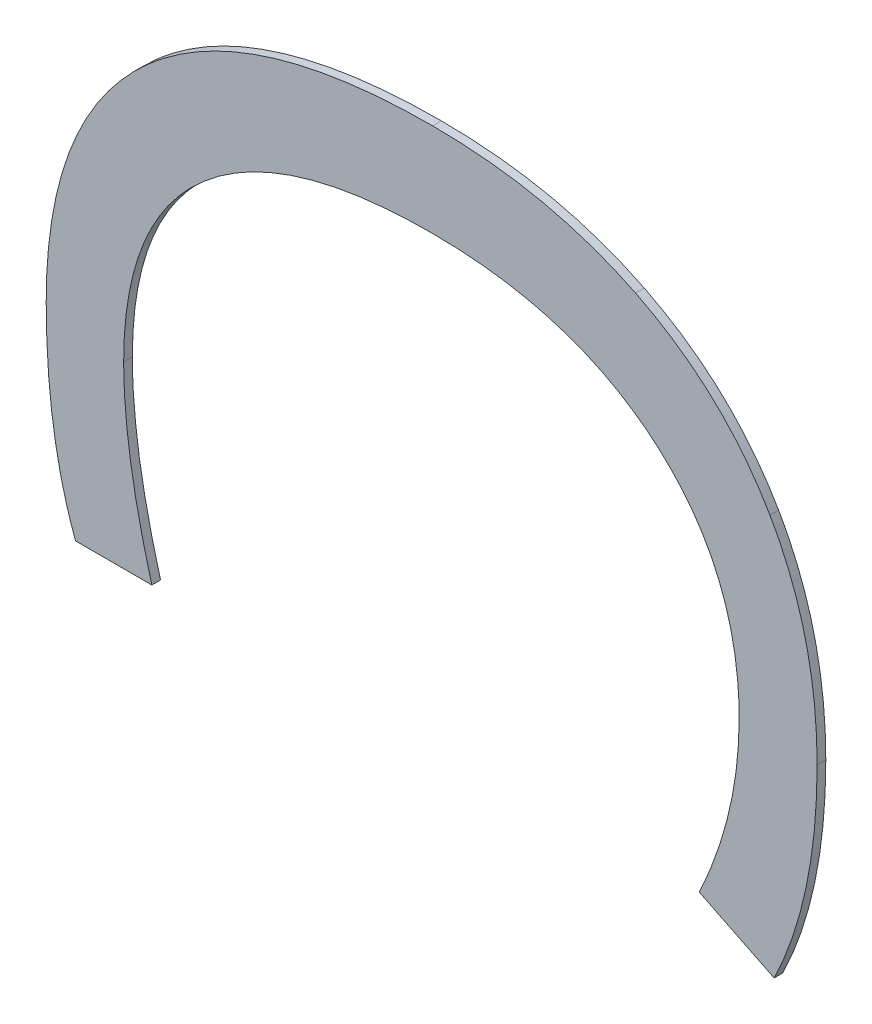
ISO-10303-21;
HEADER;
FILE_DESCRIPTION(('STEP AP214'),'2;1');
FILE_NAME('part.step','',(''),(''),'','','');
FILE_SCHEMA(('AUTOMOTIVE_DESIGN { 1 0 10303 214 1 1 1 1 }'));
ENDSEC;
DATA;
#1=APPLICATION_CONTEXT('core data for automotive mechanical design processes');
#2=APPLICATION_PROTOCOL_DEFINITION('international standard','automotive_design',2000,#1);
#3=PRODUCT_CONTEXT('',#1,'mechanical');
#4=PRODUCT('Part','Part','',(#3));
#5=PRODUCT_RELATED_PRODUCT_CATEGORY('part','',(#4));
#6=PRODUCT_DEFINITION_FORMATION('','',#4);
#7=PRODUCT_DEFINITION_CONTEXT('part definition',#1,'design');
#8=PRODUCT_DEFINITION('design','',#6,#7);
#9=PRODUCT_DEFINITION_SHAPE('','',#8);
#10=(LENGTH_UNIT() NAMED_UNIT(*) SI_UNIT(.MILLI.,.METRE.));
#11=(NAMED_UNIT(*) PLANE_ANGLE_UNIT() SI_UNIT($,.RADIAN.));
#12=(NAMED_UNIT(*) SI_UNIT($,.STERADIAN.) SOLID_ANGLE_UNIT());
#13=UNCERTAINTY_MEASURE_WITH_UNIT(LENGTH_MEASURE(1.E-05),#10,'distance_accuracy_value','');
#14=(GEOMETRIC_REPRESENTATION_CONTEXT(3) GLOBAL_UNCERTAINTY_ASSIGNED_CONTEXT((#13)) GLOBAL_UNIT_ASSIGNED_CONTEXT((#10,
#11,#12)) REPRESENTATION_CONTEXT('',''));
#15=CARTESIAN_POINT('',(0.,0.,0.));
#16=DIRECTION('',(0.,0.,1.));
#17=DIRECTION('',(1.,0.,0.));
#18=AXIS2_PLACEMENT_3D('',#15,#16,#17);
#19=CARTESIAN_POINT('',(32.574920494297,13.734089114766,2.64));
#20=DIRECTION('',(0.,0.,1.));
#21=DIRECTION('',(1.,0.,0.));
#22=AXIS2_PLACEMENT_3D('',#19,#20,#21);
#23=PLANE('',#22);
#24=CARTESIAN_POINT('',(34.040654150706,16.497481452448,2.64));
#25=CARTESIAN_POINT('',(34.205623605908,16.497481452448,2.64));
#26=CARTESIAN_POINT('',(34.300499961164,16.414996724847,2.64));
#27=B_SPLINE_CURVE_WITH_KNOTS('',2,(#24,#25,#26),.UNSPECIFIED.,.F.,.F.,(3,3),(0.,1.),.UNSPECIFIED.);
#28=CARTESIAN_POINT('',(34.300499961164,16.414996724847,2.64));
#29=VERTEX_POINT('',#28);
#30=CARTESIAN_POINT('',(34.040654150706,16.497481452448,2.64));
#31=VERTEX_POINT('',#30);
#32=EDGE_CURVE('E272',#29,#31,#27,.F.);
#33=ORIENTED_EDGE('',*,*,#32,.T.);
#34=CARTESIAN_POINT('',(33.778538118387,16.41792909475,2.64));
#35=CARTESIAN_POINT('',(33.871144251783,16.497481452448,2.64));
#36=CARTESIAN_POINT('',(34.040654150706,16.497481452448,2.64));
#37=B_SPLINE_CURVE_WITH_KNOTS('',2,(#34,#35,#36),.UNSPECIFIED.,.F.,.F.,(3,3),(0.,1.),.UNSPECIFIED.);
#38=CARTESIAN_POINT('',(33.778538118387,16.41792909475,2.64));
#39=VERTEX_POINT('',#38);
#40=EDGE_CURVE('E263',#31,#39,#37,.F.);
#41=ORIENTED_EDGE('',*,*,#40,.T.);
#42=CARTESIAN_POINT('',(33.685931984991,16.191190686425,2.64));
#43=CARTESIAN_POINT('',(33.685931984991,16.338376737053,2.64));
#44=CARTESIAN_POINT('',(33.778538118387,16.41792909475,2.64));
#45=B_SPLINE_CURVE_WITH_KNOTS('',2,(#42,#43,#44),.UNSPECIFIED.,.F.,.F.,(3,3),(0.,1.),.UNSPECIFIED.);
#46=CARTESIAN_POINT('',(33.685931984991,16.191190686425,2.64));
#47=VERTEX_POINT('',#46);
#48=EDGE_CURVE('E254',#39,#47,#45,.F.);
#49=ORIENTED_EDGE('',*,*,#48,.T.);
#50=CARTESIAN_POINT('',(33.718471831659,15.984789682268,2.64));
#51=CARTESIAN_POINT('',(33.685931984991,16.100760182313,2.64));
#52=CARTESIAN_POINT('',(33.685931984991,16.191190686425,2.64));
#53=B_SPLINE_CURVE_WITH_KNOTS('',2,(#50,#51,#52),.UNSPECIFIED.,.F.,.F.,(3,3),(0.,1.),.UNSPECIFIED.);
#54=CARTESIAN_POINT('',(33.718471831659,15.984789682268,2.64));
#55=VERTEX_POINT('',#54);
#56=EDGE_CURVE('E244',#47,#55,#53,.F.);
#57=ORIENTED_EDGE('',*,*,#56,.T.);
#58=DIRECTION('',(1.,0.,0.));
#59=VECTOR('',#58,1.);
#60=CARTESIAN_POINT('',(33.674486283111,15.984789682268,2.64));
#61=LINE('',#60,#59);
#62=CARTESIAN_POINT('',(33.630500734562,15.984789682268,2.64));
#63=VERTEX_POINT('',#62);
#64=EDGE_CURVE('E285',#55,#63,#61,.F.);
#65=ORIENTED_EDGE('',*,*,#64,.T.);
#66=CARTESIAN_POINT('',(33.596636591809,16.206514683984,2.64));
#67=CARTESIAN_POINT('',(33.596636591809,16.074652630916,2.64));
#68=CARTESIAN_POINT('',(33.630500734562,15.984789682268,2.64));
#69=B_SPLINE_CURVE_WITH_KNOTS('',2,(#66,#67,#68),.UNSPECIFIED.,.F.,.F.,(3,3),(0.,1.),.UNSPECIFIED.);
#70=CARTESIAN_POINT('',(33.596636591809,16.206514683984,2.64));
#71=VERTEX_POINT('',#70);
#72=EDGE_CURVE('E235',#63,#71,#69,.F.);
#73=ORIENTED_EDGE('',*,*,#72,.T.);
#74=CARTESIAN_POINT('',(33.712607091853,16.501170562971,2.64));
#75=CARTESIAN_POINT('',(33.596636591809,16.397402505428,2.64));
#76=CARTESIAN_POINT('',(33.596636591809,16.206514683984,2.64));
#77=B_SPLINE_CURVE_WITH_KNOTS('',2,(#74,#75,#76),.UNSPECIFIED.,.F.,.F.,(3,3),(0.,1.),.UNSPECIFIED.);
#78=CARTESIAN_POINT('',(33.712607091853,16.501170562971,2.64));
#79=VERTEX_POINT('',#78);
#80=EDGE_CURVE('E226',#71,#79,#77,.F.);
#81=ORIENTED_EDGE('',*,*,#80,.T.);
#82=CARTESIAN_POINT('',(34.041978446791,16.604938620515,2.64));
#83=CARTESIAN_POINT('',(33.828577591897,16.604938620515,2.64));
#84=CARTESIAN_POINT('',(33.712607091853,16.501170562971,2.64));
#85=B_SPLINE_CURVE_WITH_KNOTS('',2,(#82,#83,#84),.UNSPECIFIED.,.F.,.F.,(3,3),(0.,1.),.UNSPECIFIED.);
#86=CARTESIAN_POINT('',(34.041978446791,16.604938620515,2.64));
#87=VERTEX_POINT('',#86);
#88=EDGE_CURVE('E217',#79,#87,#85,.F.);
#89=ORIENTED_EDGE('',*,*,#88,.T.);
#90=CARTESIAN_POINT('',(34.276000483586,16.554993739583,2.64));
#91=CARTESIAN_POINT('',(34.175543166255,16.604938620515,2.64));
#92=CARTESIAN_POINT('',(34.041978446791,16.604938620515,2.64));
#93=B_SPLINE_CURVE_WITH_KNOTS('',2,(#90,#91,#92),.UNSPECIFIED.,.F.,.F.,(3,3),(0.,1.),.UNSPECIFIED.);
#94=CARTESIAN_POINT('',(34.276000483586,16.554993739583,2.64));
#95=VERTEX_POINT('',#94);
#96=EDGE_CURVE('E208',#87,#95,#93,.F.);
#97=ORIENTED_EDGE('',*,*,#96,.T.);
#98=CARTESIAN_POINT('',(34.430848532992,16.410740058859,2.64));
#99=CARTESIAN_POINT('',(34.376457800916,16.50504885865,2.64));
#100=CARTESIAN_POINT('',(34.276000483586,16.554993739583,2.64));
#101=B_SPLINE_CURVE_WITH_KNOTS('',2,(#98,#99,#100),.UNSPECIFIED.,.F.,.F.,(3,3),(0.,1.),.UNSPECIFIED.);
#102=CARTESIAN_POINT('',(34.430848532992,16.410740058859,2.64));
#103=VERTEX_POINT('',#102);
#104=EDGE_CURVE('E199',#95,#103,#101,.F.);
#105=ORIENTED_EDGE('',*,*,#104,.T.);
#106=CARTESIAN_POINT('',(34.485239265069,16.18873127941,2.64));
#107=CARTESIAN_POINT('',(34.485239265069,16.316431259067,2.64));
#108=CARTESIAN_POINT('',(34.430848532992,16.410740058859,2.64));
#109=B_SPLINE_CURVE_WITH_KNOTS('',2,(#106,#107,#108),.UNSPECIFIED.,.F.,.F.,(3,3),(0.,1.),.UNSPECIFIED.);
#110=CARTESIAN_POINT('',(34.485239265069,16.18873127941,2.64));
#111=VERTEX_POINT('',#110);
#112=EDGE_CURVE('E186',#103,#111,#109,.F.);
#113=ORIENTED_EDGE('',*,*,#112,.T.);
#114=CARTESIAN_POINT('',(34.435672754446,15.95111472467,2.64));
#115=CARTESIAN_POINT('',(34.485239265069,16.052896338085,2.64));
#116=CARTESIAN_POINT('',(34.485239265069,16.18873127941,2.64));
#117=B_SPLINE_CURVE_WITH_KNOTS('',2,(#114,#115,#116),.UNSPECIFIED.,.F.,.F.,(3,3),(0.,1.),.UNSPECIFIED.);
#118=CARTESIAN_POINT('',(34.435672754446,15.95111472467,2.64));
#119=VERTEX_POINT('',#118);
#120=EDGE_CURVE('E187',#111,#119,#117,.F.);
#121=ORIENTED_EDGE('',*,*,#120,.T.);
#122=DIRECTION('',(-0.8967746709571,0.442487502117049,0.));
#123=VECTOR('',#122,1.);
#124=CARTESIAN_POINT('',(34.392538539095,15.972398054613,2.64));
#125=LINE('',#124,#123);
#126=CARTESIAN_POINT('',(34.3494043237442,15.9936813845554,2.64));
#127=VERTEX_POINT('',#126);
#128=EDGE_CURVE('E21',#119,#127,#125,.T.);
#129=ORIENTED_EDGE('',*,*,#128,.T.);
#130=CARTESIAN_POINT('',(34.395376316421,16.190055575495,2.64));
#131=CARTESIAN_POINT('',(34.395376316421,16.091868480025,2.64));
#132=CARTESIAN_POINT('',(34.349404323744,15.993681384555,2.64));
#133=B_SPLINE_CURVE_WITH_KNOTS('',2,(#130,#131,#132),.UNSPECIFIED.,.F.,.F.,(3,3),(0.,1.),.UNSPECIFIED.);
#134=CARTESIAN_POINT('',(34.395376316421,16.190055575495,2.64));
#135=VERTEX_POINT('',#134);
#136=EDGE_CURVE('E123',#127,#135,#133,.F.);
#137=ORIENTED_EDGE('',*,*,#136,.T.);
#138=CARTESIAN_POINT('',(34.300499961164,16.414996724847,2.64));
#139=CARTESIAN_POINT('',(34.395376316421,16.332511997246,2.64));
#140=CARTESIAN_POINT('',(34.395376316421,16.190055575495,2.64));
#141=B_SPLINE_CURVE_WITH_KNOTS('',2,(#138,#139,#140),.UNSPECIFIED.,.F.,.F.,(3,3),(0.,1.),.UNSPECIFIED.);
#142=EDGE_CURVE('E125',#135,#29,#141,.F.);
#143=ORIENTED_EDGE('',*,*,#142,.T.);
#144=EDGE_LOOP('',(#33,#41,#49,#57,#65,#73,#81,#89,#97,#105,#113,#121,#129,#137,#143));
#145=FACE_BOUND('',#144,.T.);
#146=ADVANCED_FACE('F17',(#145),#23,.F.);
#147=CARTESIAN_POINT('',(34.395376316421,16.190055575495,2.64));
#148=CARTESIAN_POINT('',(34.395376316421,16.332511997246,2.64));
#149=CARTESIAN_POINT('',(34.300499961164,16.414996724847,2.64));
#150=(BOUNDED_CURVE() B_SPLINE_CURVE(2,(#147,#148,#149),.UNSPECIFIED.,.F.,
.F.) B_SPLINE_CURVE_WITH_KNOTS((3,3),(0.,1.),
.UNSPECIFIED.) CURVE() GEOMETRIC_REPRESENTATION_ITEM() RATIONAL_B_SPLINE_CURVE((1.,1.,1.)) REPRESENTATION_ITEM(''));
#151=DIRECTION('',(0.,0.,1.));
#152=VECTOR('',#151,1.);
#153=SURFACE_OF_LINEAR_EXTRUSION('',#150,#152);
#154=DIRECTION('',(0.,0.,1.));
#155=VECTOR('',#154,1.);
#156=CARTESIAN_POINT('',(34.300499961164,16.414996724847,2.64));
#157=LINE('',#156,#155);
#158=CARTESIAN_POINT('',(34.300499961164,16.414996724847,2.65));
#159=VERTEX_POINT('',#158);
#160=EDGE_CURVE('E137',#159,#29,#157,.F.);
#161=ORIENTED_EDGE('',*,*,#160,.T.);
#162=ORIENTED_EDGE('',*,*,#142,.F.);
#163=DIRECTION('',(0.,0.,1.));
#164=VECTOR('',#163,1.);
#165=CARTESIAN_POINT('',(34.395376316421,16.190055575495,2.64));
#166=LINE('',#165,#164);
#167=CARTESIAN_POINT('',(34.395376316421,16.190055575495,2.65));
#168=VERTEX_POINT('',#167);
#169=EDGE_CURVE('E131',#135,#168,#166,.T.);
#170=ORIENTED_EDGE('',*,*,#169,.T.);
#171=CARTESIAN_POINT('',(34.300499961164,16.414996724847,2.65));
#172=CARTESIAN_POINT('',(34.395376316421,16.332511997246,2.65));
#173=CARTESIAN_POINT('',(34.395376316421,16.190055575495,2.65));
#174=B_SPLINE_CURVE_WITH_KNOTS('',2,(#171,#172,#173),.UNSPECIFIED.,.F.,.F.,(3,3),(0.,1.),.UNSPECIFIED.);
#175=EDGE_CURVE('E377',#159,#168,#174,.T.);
#176=ORIENTED_EDGE('',*,*,#175,.F.);
#177=EDGE_LOOP('',(#161,#162,#170,#176));
#178=FACE_BOUND('',#177,.T.);
#179=ADVANCED_FACE('F134',(#178),#153,.F.);
#180=CARTESIAN_POINT('',(34.349404323744,15.993681384555,2.64));
#181=CARTESIAN_POINT('',(34.395376316421,16.091868480025,2.64));
#182=CARTESIAN_POINT('',(34.395376316421,16.190055575495,2.64));
#183=(BOUNDED_CURVE() B_SPLINE_CURVE(2,(#180,#181,#182),.UNSPECIFIED.,.F.,
.F.) B_SPLINE_CURVE_WITH_KNOTS((3,3),(0.,1.),
.UNSPECIFIED.) CURVE() GEOMETRIC_REPRESENTATION_ITEM() RATIONAL_B_SPLINE_CURVE((1.,1.,1.)) REPRESENTATION_ITEM(''));
#184=DIRECTION('',(0.,0.,1.));
#185=VECTOR('',#184,1.);
#186=SURFACE_OF_LINEAR_EXTRUSION('',#183,#185);
#187=ORIENTED_EDGE('',*,*,#169,.F.);
#188=ORIENTED_EDGE('',*,*,#136,.F.);
#189=DIRECTION('',(0.,0.,1.));
#190=VECTOR('',#189,1.);
#191=CARTESIAN_POINT('',(34.3494043237444,15.9936813845558,2.64));
#192=LINE('',#191,#190);
#193=CARTESIAN_POINT('',(34.3494043237442,15.9936813845554,2.65));
#194=VERTEX_POINT('',#193);
#195=EDGE_CURVE('E145',#127,#194,#192,.T.);
#196=ORIENTED_EDGE('',*,*,#195,.T.);
#197=CARTESIAN_POINT('',(34.395376316421,16.190055575495,2.65));
#198=CARTESIAN_POINT('',(34.395376316421,16.091868480025,2.65));
#199=CARTESIAN_POINT('',(34.349404323744,15.993681384555,2.65));
#200=B_SPLINE_CURVE_WITH_KNOTS('',2,(#197,#198,#199),.UNSPECIFIED.,.F.,.F.,(3,3),(0.,1.),.UNSPECIFIED.);
#201=EDGE_CURVE('E142',#168,#194,#200,.T.);
#202=ORIENTED_EDGE('',*,*,#201,.F.);
#203=EDGE_LOOP('',(#187,#188,#196,#202));
#204=FACE_BOUND('',#203,.T.);
#205=ADVANCED_FACE('F140',(#204),#186,.F.);
#206=CARTESIAN_POINT('',(34.392538539095,15.972398054613,2.64));
#207=DIRECTION('',(0.442487502117049,0.8967746709571,0.));
#208=DIRECTION('',(-0.8967746709571,0.442487502117049,0.));
#209=AXIS2_PLACEMENT_3D('',#206,#207,#208);
#210=PLANE('',#209);
#211=ORIENTED_EDGE('',*,*,#195,.F.);
#212=ORIENTED_EDGE('',*,*,#128,.F.);
#213=DIRECTION('',(0.,0.,1.));
#214=VECTOR('',#213,1.);
#215=CARTESIAN_POINT('',(34.435672754446,15.95111472467,2.64));
#216=LINE('',#215,#214);
#217=CARTESIAN_POINT('',(34.435672754446,15.95111472467,2.65));
#218=VERTEX_POINT('',#217);
#219=EDGE_CURVE('E182',#119,#218,#216,.T.);
#220=ORIENTED_EDGE('',*,*,#219,.T.);
#221=DIRECTION('',(0.896774670960663,-0.442487502109827,0.));
#222=VECTOR('',#221,1.);
#223=CARTESIAN_POINT('',(34.349404323744,15.993681384555,2.65));
#224=LINE('',#223,#222);
#225=EDGE_CURVE('E435',#194,#218,#224,.T.);
#226=ORIENTED_EDGE('',*,*,#225,.F.);
#227=EDGE_LOOP('',(#211,#212,#220,#226));
#228=FACE_BOUND('',#227,.T.);
#229=ADVANCED_FACE('F164',(#228),#210,.F.);
#230=CARTESIAN_POINT('',(34.485239265069,16.18873127941,2.64));
#231=CARTESIAN_POINT('',(34.485239265069,16.052896338085,2.64));
#232=CARTESIAN_POINT('',(34.435672754446,15.95111472467,2.64));
#233=(BOUNDED_CURVE() B_SPLINE_CURVE(2,(#230,#231,#232),.UNSPECIFIED.,.F.,
.F.) B_SPLINE_CURVE_WITH_KNOTS((3,3),(0.,1.),
.UNSPECIFIED.) CURVE() GEOMETRIC_REPRESENTATION_ITEM() RATIONAL_B_SPLINE_CURVE((1.,1.,1.)) REPRESENTATION_ITEM(''));
#234=DIRECTION('',(0.,0.,1.));
#235=VECTOR('',#234,1.);
#236=SURFACE_OF_LINEAR_EXTRUSION('',#233,#235);
#237=ORIENTED_EDGE('',*,*,#219,.F.);
#238=ORIENTED_EDGE('',*,*,#120,.F.);
#239=DIRECTION('',(0.,0.,1.));
#240=VECTOR('',#239,1.);
#241=CARTESIAN_POINT('',(34.485239265069,16.18873127941,2.64));
#242=LINE('',#241,#240);
#243=CARTESIAN_POINT('',(34.485239265069,16.18873127941,2.65));
#244=VERTEX_POINT('',#243);
#245=EDGE_CURVE('E181',#111,#244,#242,.T.);
#246=ORIENTED_EDGE('',*,*,#245,.T.);
#247=CARTESIAN_POINT('',(34.435672754446,15.95111472467,2.65));
#248=CARTESIAN_POINT('',(34.485239265069,16.052896338085,2.65));
#249=CARTESIAN_POINT('',(34.485239265069,16.18873127941,2.65));
#250=B_SPLINE_CURVE_WITH_KNOTS('',2,(#247,#248,#249),.UNSPECIFIED.,.F.,.F.,(3,3),(0.,1.),.UNSPECIFIED.);
#251=EDGE_CURVE('E385',#218,#244,#250,.T.);
#252=ORIENTED_EDGE('',*,*,#251,.F.);
#253=EDGE_LOOP('',(#237,#238,#246,#252));
#254=FACE_BOUND('',#253,.T.);
#255=ADVANCED_FACE('F167',(#254),#236,.F.);
#256=CARTESIAN_POINT('',(34.430848532992,16.410740058859,2.64));
#257=CARTESIAN_POINT('',(34.485239265069,16.316431259067,2.64));
#258=CARTESIAN_POINT('',(34.485239265069,16.18873127941,2.64));
#259=(BOUNDED_CURVE() B_SPLINE_CURVE(2,(#256,#257,#258),.UNSPECIFIED.,.F.,
.F.) B_SPLINE_CURVE_WITH_KNOTS((3,3),(0.,1.),
.UNSPECIFIED.) CURVE() GEOMETRIC_REPRESENTATION_ITEM() RATIONAL_B_SPLINE_CURVE((1.,1.,1.)) REPRESENTATION_ITEM(''));
#260=DIRECTION('',(0.,0.,1.));
#261=VECTOR('',#260,1.);
#262=SURFACE_OF_LINEAR_EXTRUSION('',#259,#261);
#263=ORIENTED_EDGE('',*,*,#245,.F.);
#264=ORIENTED_EDGE('',*,*,#112,.F.);
#265=DIRECTION('',(0.,0.,1.));
#266=VECTOR('',#265,1.);
#267=CARTESIAN_POINT('',(34.430848532992,16.410740058859,2.64));
#268=LINE('',#267,#266);
#269=CARTESIAN_POINT('',(34.430848532992,16.410740058859,2.65));
#270=VERTEX_POINT('',#269);
#271=EDGE_CURVE('E207',#103,#270,#268,.T.);
#272=ORIENTED_EDGE('',*,*,#271,.T.);
#273=CARTESIAN_POINT('',(34.485239265069,16.18873127941,2.65));
#274=CARTESIAN_POINT('',(34.485239265069,16.316431259067,2.65));
#275=CARTESIAN_POINT('',(34.430848532992,16.410740058859,2.65));
#276=B_SPLINE_CURVE_WITH_KNOTS('',2,(#273,#274,#275),.UNSPECIFIED.,.F.,.F.,(3,3),(0.,1.),.UNSPECIFIED.);
#277=EDGE_CURVE('E389',#244,#270,#276,.T.);
#278=ORIENTED_EDGE('',*,*,#277,.F.);
#279=EDGE_LOOP('',(#263,#264,#272,#278));
#280=FACE_BOUND('',#279,.T.);
#281=ADVANCED_FACE('F172',(#280),#262,.F.);
#282=CARTESIAN_POINT('',(34.276000483586,16.554993739583,2.64));
#283=CARTESIAN_POINT('',(34.376457800916,16.50504885865,2.64));
#284=CARTESIAN_POINT('',(34.430848532992,16.410740058859,2.64));
#285=(BOUNDED_CURVE() B_SPLINE_CURVE(2,(#282,#283,#284),.UNSPECIFIED.,.F.,
.F.) B_SPLINE_CURVE_WITH_KNOTS((3,3),(0.,1.),
.UNSPECIFIED.) CURVE() GEOMETRIC_REPRESENTATION_ITEM() RATIONAL_B_SPLINE_CURVE((1.,1.,1.)) REPRESENTATION_ITEM(''));
#286=DIRECTION('',(0.,0.,1.));
#287=VECTOR('',#286,1.);
#288=SURFACE_OF_LINEAR_EXTRUSION('',#285,#287);
#289=ORIENTED_EDGE('',*,*,#271,.F.);
#290=ORIENTED_EDGE('',*,*,#104,.F.);
#291=DIRECTION('',(0.,0.,1.));
#292=VECTOR('',#291,1.);
#293=CARTESIAN_POINT('',(34.276000483586,16.554993739583,2.64));
#294=LINE('',#293,#292);
#295=CARTESIAN_POINT('',(34.276000483586,16.554993739583,2.65));
#296=VERTEX_POINT('',#295);
#297=EDGE_CURVE('E216',#95,#296,#294,.T.);
#298=ORIENTED_EDGE('',*,*,#297,.T.);
#299=CARTESIAN_POINT('',(34.430848532992,16.410740058859,2.65));
#300=CARTESIAN_POINT('',(34.376457800916,16.50504885865,2.65));
#301=CARTESIAN_POINT('',(34.276000483586,16.554993739583,2.65));
#302=B_SPLINE_CURVE_WITH_KNOTS('',2,(#299,#300,#301),.UNSPECIFIED.,.F.,.F.,(3,3),(0.,1.),.UNSPECIFIED.);
#303=EDGE_CURVE('E393',#270,#296,#302,.T.);
#304=ORIENTED_EDGE('',*,*,#303,.F.);
#305=EDGE_LOOP('',(#289,#290,#298,#304));
#306=FACE_BOUND('',#305,.T.);
#307=ADVANCED_FACE('F348',(#306),#288,.F.);
#308=CARTESIAN_POINT('',(34.041978446791,16.604938620515,2.64));
#309=CARTESIAN_POINT('',(34.175543166255,16.604938620515,2.64));
#310=CARTESIAN_POINT('',(34.276000483586,16.554993739583,2.64));
#311=(BOUNDED_CURVE() B_SPLINE_CURVE(2,(#308,#309,#310),.UNSPECIFIED.,.F.,
.F.) B_SPLINE_CURVE_WITH_KNOTS((3,3),(0.,1.),
.UNSPECIFIED.) CURVE() GEOMETRIC_REPRESENTATION_ITEM() RATIONAL_B_SPLINE_CURVE((1.,1.,1.)) REPRESENTATION_ITEM(''));
#312=DIRECTION('',(0.,0.,1.));
#313=VECTOR('',#312,1.);
#314=SURFACE_OF_LINEAR_EXTRUSION('',#311,#313);
#315=ORIENTED_EDGE('',*,*,#297,.F.);
#316=ORIENTED_EDGE('',*,*,#96,.F.);
#317=DIRECTION('',(0.,0.,1.));
#318=VECTOR('',#317,1.);
#319=CARTESIAN_POINT('',(34.041978446791,16.604938620515,2.64));
#320=LINE('',#319,#318);
#321=CARTESIAN_POINT('',(34.041978446791,16.604938620515,2.65));
#322=VERTEX_POINT('',#321);
#323=EDGE_CURVE('E225',#87,#322,#320,.T.);
#324=ORIENTED_EDGE('',*,*,#323,.T.);
#325=CARTESIAN_POINT('',(34.276000483586,16.554993739583,2.65));
#326=CARTESIAN_POINT('',(34.175543166255,16.604938620515,2.65));
#327=CARTESIAN_POINT('',(34.041978446791,16.604938620515,2.65));
#328=B_SPLINE_CURVE_WITH_KNOTS('',2,(#325,#326,#327),.UNSPECIFIED.,.F.,.F.,(3,3),(0.,1.),.UNSPECIFIED.);
#329=EDGE_CURVE('E397',#296,#322,#328,.T.);
#330=ORIENTED_EDGE('',*,*,#329,.F.);
#331=EDGE_LOOP('',(#315,#316,#324,#330));
#332=FACE_BOUND('',#331,.T.);
#333=ADVANCED_FACE('F323',(#332),#314,.F.);
#334=CARTESIAN_POINT('',(33.712607091853,16.501170562971,2.64));
#335=CARTESIAN_POINT('',(33.828577591897,16.604938620515,2.64));
#336=CARTESIAN_POINT('',(34.041978446791,16.604938620515,2.64));
#337=(BOUNDED_CURVE() B_SPLINE_CURVE(2,(#334,#335,#336),.UNSPECIFIED.,.F.,
.F.) B_SPLINE_CURVE_WITH_KNOTS((3,3),(0.,1.),
.UNSPECIFIED.) CURVE() GEOMETRIC_REPRESENTATION_ITEM() RATIONAL_B_SPLINE_CURVE((1.,1.,1.)) REPRESENTATION_ITEM(''));
#338=DIRECTION('',(0.,0.,1.));
#339=VECTOR('',#338,1.);
#340=SURFACE_OF_LINEAR_EXTRUSION('',#337,#339);
#341=ORIENTED_EDGE('',*,*,#323,.F.);
#342=ORIENTED_EDGE('',*,*,#88,.F.);
#343=DIRECTION('',(0.,0.,1.));
#344=VECTOR('',#343,1.);
#345=CARTESIAN_POINT('',(33.712607091853,16.501170562971,2.64));
#346=LINE('',#345,#344);
#347=CARTESIAN_POINT('',(33.712607091853,16.501170562971,2.65));
#348=VERTEX_POINT('',#347);
#349=EDGE_CURVE('E234',#79,#348,#346,.T.);
#350=ORIENTED_EDGE('',*,*,#349,.T.);
#351=CARTESIAN_POINT('',(34.041978446791,16.604938620515,2.65));
#352=CARTESIAN_POINT('',(33.828577591897,16.604938620515,2.65));
#353=CARTESIAN_POINT('',(33.712607091853,16.501170562971,2.65));
#354=B_SPLINE_CURVE_WITH_KNOTS('',2,(#351,#352,#353),.UNSPECIFIED.,.F.,.F.,(3,3),(0.,1.),.UNSPECIFIED.);
#355=EDGE_CURVE('E401',#322,#348,#354,.T.);
#356=ORIENTED_EDGE('',*,*,#355,.F.);
#357=EDGE_LOOP('',(#341,#342,#350,#356));
#358=FACE_BOUND('',#357,.T.);
#359=ADVANCED_FACE('F319',(#358),#340,.F.);
#360=CARTESIAN_POINT('',(33.596636591809,16.206514683984,2.64));
#361=CARTESIAN_POINT('',(33.596636591809,16.397402505428,2.64));
#362=CARTESIAN_POINT('',(33.712607091853,16.501170562971,2.64));
#363=(BOUNDED_CURVE() B_SPLINE_CURVE(2,(#360,#361,#362),.UNSPECIFIED.,.F.,
.F.) B_SPLINE_CURVE_WITH_KNOTS((3,3),(0.,1.),
.UNSPECIFIED.) CURVE() GEOMETRIC_REPRESENTATION_ITEM() RATIONAL_B_SPLINE_CURVE((1.,1.,1.)) REPRESENTATION_ITEM(''));
#364=DIRECTION('',(0.,0.,1.));
#365=VECTOR('',#364,1.);
#366=SURFACE_OF_LINEAR_EXTRUSION('',#363,#365);
#367=ORIENTED_EDGE('',*,*,#349,.F.);
#368=ORIENTED_EDGE('',*,*,#80,.F.);
#369=DIRECTION('',(0.,0.,1.));
#370=VECTOR('',#369,1.);
#371=CARTESIAN_POINT('',(33.596636591809,16.206514683984,2.64));
#372=LINE('',#371,#370);
#373=CARTESIAN_POINT('',(33.596636591809,16.206514683984,2.65));
#374=VERTEX_POINT('',#373);
#375=EDGE_CURVE('E243',#71,#374,#372,.T.);
#376=ORIENTED_EDGE('',*,*,#375,.T.);
#377=CARTESIAN_POINT('',(33.712607091853,16.501170562971,2.65));
#378=CARTESIAN_POINT('',(33.596636591809,16.397402505428,2.65));
#379=CARTESIAN_POINT('',(33.596636591809,16.206514683984,2.65));
#380=B_SPLINE_CURVE_WITH_KNOTS('',2,(#377,#378,#379),.UNSPECIFIED.,.F.,.F.,(3,3),(0.,1.),.UNSPECIFIED.);
#381=EDGE_CURVE('E405',#348,#374,#380,.T.);
#382=ORIENTED_EDGE('',*,*,#381,.F.);
#383=EDGE_LOOP('',(#367,#368,#376,#382));
#384=FACE_BOUND('',#383,.T.);
#385=ADVANCED_FACE('F314',(#384),#366,.F.);
#386=CARTESIAN_POINT('',(33.630500734562,15.984789682268,2.64));
#387=CARTESIAN_POINT('',(33.596636591809,16.074652630916,2.64));
#388=CARTESIAN_POINT('',(33.596636591809,16.206514683984,2.64));
#389=(BOUNDED_CURVE() B_SPLINE_CURVE(2,(#386,#387,#388),.UNSPECIFIED.,.F.,
.F.) B_SPLINE_CURVE_WITH_KNOTS((3,3),(0.,1.),
.UNSPECIFIED.) CURVE() GEOMETRIC_REPRESENTATION_ITEM() RATIONAL_B_SPLINE_CURVE((1.,1.,1.)) REPRESENTATION_ITEM(''));
#390=DIRECTION('',(0.,0.,1.));
#391=VECTOR('',#390,1.);
#392=SURFACE_OF_LINEAR_EXTRUSION('',#389,#391);
#393=ORIENTED_EDGE('',*,*,#375,.F.);
#394=ORIENTED_EDGE('',*,*,#72,.F.);
#395=DIRECTION('',(0.,0.,1.));
#396=VECTOR('',#395,1.);
#397=CARTESIAN_POINT('',(33.630500734562,15.984789682268,2.64));
#398=LINE('',#397,#396);
#399=CARTESIAN_POINT('',(33.630500734562,15.984789682268,2.65));
#400=VERTEX_POINT('',#399);
#401=EDGE_CURVE('E253',#63,#400,#398,.T.);
#402=ORIENTED_EDGE('',*,*,#401,.T.);
#403=CARTESIAN_POINT('',(33.596636591809,16.206514683984,2.65));
#404=CARTESIAN_POINT('',(33.596636591809,16.074652630916,2.65));
#405=CARTESIAN_POINT('',(33.630500734562,15.984789682268,2.65));
#406=B_SPLINE_CURVE_WITH_KNOTS('',2,(#403,#404,#405),.UNSPECIFIED.,.F.,.F.,(3,3),(0.,1.),.UNSPECIFIED.);
#407=EDGE_CURVE('E409',#374,#400,#406,.T.);
#408=ORIENTED_EDGE('',*,*,#407,.F.);
#409=EDGE_LOOP('',(#393,#394,#402,#408));
#410=FACE_BOUND('',#409,.T.);
#411=ADVANCED_FACE('F318',(#410),#392,.F.);
#412=CARTESIAN_POINT('',(33.674486283111,15.984789682268,2.64));
#413=DIRECTION('',(0.,1.,0.));
#414=DIRECTION('',(0.,0.,1.));
#415=AXIS2_PLACEMENT_3D('',#412,#413,#414);
#416=PLANE('',#415);
#417=ORIENTED_EDGE('',*,*,#401,.F.);
#418=ORIENTED_EDGE('',*,*,#64,.F.);
#419=DIRECTION('',(0.,0.,1.));
#420=VECTOR('',#419,1.);
#421=CARTESIAN_POINT('',(33.718471831659,15.984789682268,2.64));
#422=LINE('',#421,#420);
#423=CARTESIAN_POINT('',(33.718471831659,15.984789682268,2.65));
#424=VERTEX_POINT('',#423);
#425=EDGE_CURVE('E252',#55,#424,#422,.T.);
#426=ORIENTED_EDGE('',*,*,#425,.T.);
#427=DIRECTION('',(1.,0.,0.));
#428=VECTOR('',#427,1.);
#429=CARTESIAN_POINT('',(32.574920494297,15.984789682268,2.65));
#430=LINE('',#429,#428);
#431=EDGE_CURVE('E427',#400,#424,#430,.T.);
#432=ORIENTED_EDGE('',*,*,#431,.F.);
#433=EDGE_LOOP('',(#417,#418,#426,#432));
#434=FACE_BOUND('',#433,.T.);
#435=ADVANCED_FACE('F481',(#434),#416,.F.);
#436=CARTESIAN_POINT('',(33.685931984991,16.191190686425,2.64));
#437=CARTESIAN_POINT('',(33.685931984991,16.100760182313,2.64));
#438=CARTESIAN_POINT('',(33.718471831659,15.984789682268,2.64));
#439=(BOUNDED_CURVE() B_SPLINE_CURVE(2,(#436,#437,#438),.UNSPECIFIED.,.F.,
.F.) B_SPLINE_CURVE_WITH_KNOTS((3,3),(0.,1.),
.UNSPECIFIED.) CURVE() GEOMETRIC_REPRESENTATION_ITEM() RATIONAL_B_SPLINE_CURVE((1.,1.,1.)) REPRESENTATION_ITEM(''));
#440=DIRECTION('',(0.,0.,1.));
#441=VECTOR('',#440,1.);
#442=SURFACE_OF_LINEAR_EXTRUSION('',#439,#441);
#443=ORIENTED_EDGE('',*,*,#425,.F.);
#444=ORIENTED_EDGE('',*,*,#56,.F.);
#445=DIRECTION('',(0.,0.,1.));
#446=VECTOR('',#445,1.);
#447=CARTESIAN_POINT('',(33.685931984991,16.191190686425,2.64));
#448=LINE('',#447,#446);
#449=CARTESIAN_POINT('',(33.685931984991,16.191190686425,2.65));
#450=VERTEX_POINT('',#449);
#451=EDGE_CURVE('E262',#47,#450,#448,.T.);
#452=ORIENTED_EDGE('',*,*,#451,.T.);
#453=CARTESIAN_POINT('',(33.718471831659,15.984789682268,2.65));
#454=CARTESIAN_POINT('',(33.685931984991,16.100760182313,2.65));
#455=CARTESIAN_POINT('',(33.685931984991,16.191190686425,2.65));
#456=B_SPLINE_CURVE_WITH_KNOTS('',2,(#453,#454,#455),.UNSPECIFIED.,.F.,.F.,(3,3),(0.,1.),.UNSPECIFIED.);
#457=EDGE_CURVE('E413',#424,#450,#456,.T.);
#458=ORIENTED_EDGE('',*,*,#457,.F.);
#459=EDGE_LOOP('',(#443,#444,#452,#458));
#460=FACE_BOUND('',#459,.T.);
#461=ADVANCED_FACE('F459',(#460),#442,.F.);
#462=CARTESIAN_POINT('',(33.778538118387,16.41792909475,2.64));
#463=CARTESIAN_POINT('',(33.685931984991,16.338376737053,2.64));
#464=CARTESIAN_POINT('',(33.685931984991,16.191190686425,2.64));
#465=(BOUNDED_CURVE() B_SPLINE_CURVE(2,(#462,#463,#464),.UNSPECIFIED.,.F.,
.F.) B_SPLINE_CURVE_WITH_KNOTS((3,3),(0.,1.),
.UNSPECIFIED.) CURVE() GEOMETRIC_REPRESENTATION_ITEM() RATIONAL_B_SPLINE_CURVE((1.,1.,1.)) REPRESENTATION_ITEM(''));
#466=DIRECTION('',(0.,0.,1.));
#467=VECTOR('',#466,1.);
#468=SURFACE_OF_LINEAR_EXTRUSION('',#465,#467);
#469=ORIENTED_EDGE('',*,*,#451,.F.);
#470=ORIENTED_EDGE('',*,*,#48,.F.);
#471=DIRECTION('',(0.,0.,1.));
#472=VECTOR('',#471,1.);
#473=CARTESIAN_POINT('',(33.778538118387,16.41792909475,2.64));
#474=LINE('',#473,#472);
#475=CARTESIAN_POINT('',(33.778538118387,16.41792909475,2.65));
#476=VERTEX_POINT('',#475);
#477=EDGE_CURVE('E271',#39,#476,#474,.T.);
#478=ORIENTED_EDGE('',*,*,#477,.T.);
#479=CARTESIAN_POINT('',(33.685931984991,16.191190686425,2.65));
#480=CARTESIAN_POINT('',(33.685931984991,16.338376737053,2.65));
#481=CARTESIAN_POINT('',(33.778538118387,16.41792909475,2.65));
#482=B_SPLINE_CURVE_WITH_KNOTS('',2,(#479,#480,#481),.UNSPECIFIED.,.F.,.F.,(3,3),(0.,1.),.UNSPECIFIED.);
#483=EDGE_CURVE('E416',#450,#476,#482,.T.);
#484=ORIENTED_EDGE('',*,*,#483,.F.);
#485=EDGE_LOOP('',(#469,#470,#478,#484));
#486=FACE_BOUND('',#485,.T.);
#487=ADVANCED_FACE('F456',(#486),#468,.F.);
#488=CARTESIAN_POINT('',(34.040654150706,16.497481452448,2.64));
#489=CARTESIAN_POINT('',(33.871144251783,16.497481452448,2.64));
#490=CARTESIAN_POINT('',(33.778538118387,16.41792909475,2.64));
#491=(BOUNDED_CURVE() B_SPLINE_CURVE(2,(#488,#489,#490),.UNSPECIFIED.,.F.,
.F.) B_SPLINE_CURVE_WITH_KNOTS((3,3),(0.,1.),
.UNSPECIFIED.) CURVE() GEOMETRIC_REPRESENTATION_ITEM() RATIONAL_B_SPLINE_CURVE((1.,1.,1.)) REPRESENTATION_ITEM(''));
#492=DIRECTION('',(0.,0.,1.));
#493=VECTOR('',#492,1.);
#494=SURFACE_OF_LINEAR_EXTRUSION('',#491,#493);
#495=ORIENTED_EDGE('',*,*,#477,.F.);
#496=ORIENTED_EDGE('',*,*,#40,.F.);
#497=DIRECTION('',(0.,0.,1.));
#498=VECTOR('',#497,1.);
#499=CARTESIAN_POINT('',(34.040654150706,16.497481452448,2.64));
#500=LINE('',#499,#498);
#501=CARTESIAN_POINT('',(34.040654150706,16.497481452448,2.65));
#502=VERTEX_POINT('',#501);
#503=EDGE_CURVE('E36',#31,#502,#500,.T.);
#504=ORIENTED_EDGE('',*,*,#503,.T.);
#505=CARTESIAN_POINT('',(33.778538118387,16.41792909475,2.65));
#506=CARTESIAN_POINT('',(33.871144251783,16.497481452448,2.65));
#507=CARTESIAN_POINT('',(34.040654150706,16.497481452448,2.65));
#508=B_SPLINE_CURVE_WITH_KNOTS('',2,(#505,#506,#507),.UNSPECIFIED.,.F.,.F.,(3,3),(0.,1.),.UNSPECIFIED.);
#509=EDGE_CURVE('E27',#476,#502,#508,.T.);
#510=ORIENTED_EDGE('',*,*,#509,.F.);
#511=EDGE_LOOP('',(#495,#496,#504,#510));
#512=FACE_BOUND('',#511,.T.);
#513=ADVANCED_FACE('F367',(#512),#494,.F.);
#514=CARTESIAN_POINT('',(34.300499961164,16.414996724847,2.64));
#515=CARTESIAN_POINT('',(34.205623605908,16.497481452448,2.64));
#516=CARTESIAN_POINT('',(34.040654150706,16.497481452448,2.64));
#517=(BOUNDED_CURVE() B_SPLINE_CURVE(2,(#514,#515,#516),.UNSPECIFIED.,.F.,
.F.) B_SPLINE_CURVE_WITH_KNOTS((3,3),(0.,1.),
.UNSPECIFIED.) CURVE() GEOMETRIC_REPRESENTATION_ITEM() RATIONAL_B_SPLINE_CURVE((1.,1.,1.)) REPRESENTATION_ITEM(''));
#518=DIRECTION('',(0.,0.,1.));
#519=VECTOR('',#518,1.);
#520=SURFACE_OF_LINEAR_EXTRUSION('',#517,#519);
#521=ORIENTED_EDGE('',*,*,#503,.F.);
#522=ORIENTED_EDGE('',*,*,#32,.F.);
#523=ORIENTED_EDGE('',*,*,#160,.F.);
#524=CARTESIAN_POINT('',(34.040654150706,16.497481452448,2.65));
#525=CARTESIAN_POINT('',(34.205623605908,16.497481452448,2.65));
#526=CARTESIAN_POINT('',(34.300499961164,16.414996724847,2.65));
#527=B_SPLINE_CURVE_WITH_KNOTS('',2,(#524,#525,#526),.UNSPECIFIED.,.F.,.F.,(3,3),(0.,1.),.UNSPECIFIED.);
#528=EDGE_CURVE('E11',#502,#159,#527,.T.);
#529=ORIENTED_EDGE('',*,*,#528,.F.);
#530=EDGE_LOOP('',(#521,#522,#523,#529));
#531=FACE_BOUND('',#530,.T.);
#532=ADVANCED_FACE('F361',(#531),#520,.F.);
#533=CARTESIAN_POINT('',(32.574920494297,13.734089114766,2.65));
#534=DIRECTION('',(0.,0.,1.));
#535=DIRECTION('',(1.,0.,0.));
#536=AXIS2_PLACEMENT_3D('',#533,#534,#535);
#537=PLANE('',#536);
#538=ORIENTED_EDGE('',*,*,#509,.T.);
#539=ORIENTED_EDGE('',*,*,#528,.T.);
#540=ORIENTED_EDGE('',*,*,#175,.T.);
#541=ORIENTED_EDGE('',*,*,#201,.T.);
#542=ORIENTED_EDGE('',*,*,#225,.T.);
#543=ORIENTED_EDGE('',*,*,#251,.T.);
#544=ORIENTED_EDGE('',*,*,#277,.T.);
#545=ORIENTED_EDGE('',*,*,#303,.T.);
#546=ORIENTED_EDGE('',*,*,#329,.T.);
#547=ORIENTED_EDGE('',*,*,#355,.T.);
#548=ORIENTED_EDGE('',*,*,#381,.T.);
#549=ORIENTED_EDGE('',*,*,#407,.T.);
#550=ORIENTED_EDGE('',*,*,#431,.T.);
#551=ORIENTED_EDGE('',*,*,#457,.T.);
#552=ORIENTED_EDGE('',*,*,#483,.T.);
#553=EDGE_LOOP('',(#538,#539,#540,#541,#542,#543,#544,#545,#546,#547,#548,#549,#550,#551,#552));
#554=FACE_BOUND('',#553,.T.);
#555=ADVANCED_FACE('F359',(#554),#537,.T.);
#556=CLOSED_SHELL('',(#146,#179,#205,#229,#255,#281,#307,#333,#359,#385,#411,#435,#461,#487,
#513,#532,#555));
#557=MANIFOLD_SOLID_BREP('B1',#556);
#558=ADVANCED_BREP_SHAPE_REPRESENTATION('',(#18,#557),#14);
#559=SHAPE_DEFINITION_REPRESENTATION(#9,#558);
ENDSEC;
END-ISO-10303-21;
